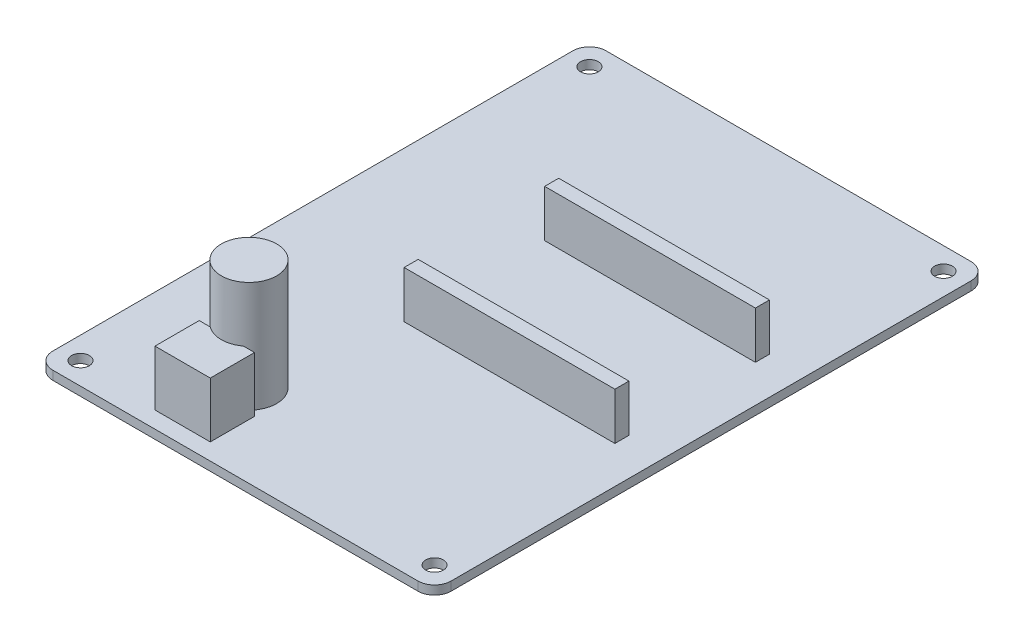
ISO-10303-21;
HEADER;
FILE_DESCRIPTION(('STEP AP214'),'2;1');
FILE_NAME('part.step','',(''),(''),'','','');
FILE_SCHEMA(('AUTOMOTIVE_DESIGN { 1 0 10303 214 1 1 1 1 }'));
ENDSEC;
DATA;
#1=APPLICATION_CONTEXT('core data for automotive mechanical design processes');
#2=APPLICATION_PROTOCOL_DEFINITION('international standard','automotive_design',2000,#1);
#3=PRODUCT_CONTEXT('',#1,'mechanical');
#4=PRODUCT('Part','Part','',(#3));
#5=PRODUCT_RELATED_PRODUCT_CATEGORY('part','',(#4));
#6=PRODUCT_DEFINITION_FORMATION('','',#4);
#7=PRODUCT_DEFINITION_CONTEXT('part definition',#1,'design');
#8=PRODUCT_DEFINITION('design','',#6,#7);
#9=PRODUCT_DEFINITION_SHAPE('','',#8);
#10=(LENGTH_UNIT() NAMED_UNIT(*) SI_UNIT(.MILLI.,.METRE.));
#11=(NAMED_UNIT(*) PLANE_ANGLE_UNIT() SI_UNIT($,.RADIAN.));
#12=(NAMED_UNIT(*) SI_UNIT($,.STERADIAN.) SOLID_ANGLE_UNIT());
#13=UNCERTAINTY_MEASURE_WITH_UNIT(LENGTH_MEASURE(1.E-05),#10,'distance_accuracy_value','');
#14=(GEOMETRIC_REPRESENTATION_CONTEXT(3) GLOBAL_UNCERTAINTY_ASSIGNED_CONTEXT((#13)) GLOBAL_UNIT_ASSIGNED_CONTEXT((#10,
#11,#12)) REPRESENTATION_CONTEXT('',''));
#15=CARTESIAN_POINT('',(0.,0.,0.));
#16=DIRECTION('',(0.,0.,1.));
#17=DIRECTION('',(1.,0.,0.));
#18=AXIS2_PLACEMENT_3D('',#15,#16,#17);
#19=CARTESIAN_POINT('',(237.42,513.12,520.85));
#20=DIRECTION('',(0.,1.,0.));
#21=DIRECTION('',(1.,0.,0.));
#22=AXIS2_PLACEMENT_3D('',#19,#20,#21);
#23=PLANE('',#22);
#24=DIRECTION('',(1.,0.,0.));
#25=VECTOR('',#24,1.);
#26=CARTESIAN_POINT('',(237.42,513.12,520.85));
#27=LINE('',#26,#25);
#28=CARTESIAN_POINT('',(237.42,513.12,520.85));
#29=VERTEX_POINT('',#28);
#30=CARTESIAN_POINT('',(275.52,513.12,520.85));
#31=VERTEX_POINT('',#30);
#32=EDGE_CURVE('E9',#29,#31,#27,.T.);
#33=ORIENTED_EDGE('',*,*,#32,.F.);
#34=DIRECTION('',(0.,0.,1.));
#35=VECTOR('',#34,1.);
#36=CARTESIAN_POINT('',(237.42,513.12,520.85));
#37=LINE('',#36,#35);
#38=CARTESIAN_POINT('',(237.42,513.12,523.39));
#39=VERTEX_POINT('',#38);
#40=EDGE_CURVE('E145',#29,#39,#37,.T.);
#41=ORIENTED_EDGE('',*,*,#40,.T.);
#42=DIRECTION('',(1.,0.,0.));
#43=VECTOR('',#42,1.);
#44=CARTESIAN_POINT('',(237.42,513.12,523.39));
#45=LINE('',#44,#43);
#46=CARTESIAN_POINT('',(275.52,513.12,523.39));
#47=VERTEX_POINT('',#46);
#48=EDGE_CURVE('E291',#39,#47,#45,.T.);
#49=ORIENTED_EDGE('',*,*,#48,.T.);
#50=DIRECTION('',(0.,0.,1.));
#51=VECTOR('',#50,1.);
#52=CARTESIAN_POINT('',(275.52,513.12,520.85));
#53=LINE('',#52,#51);
#54=EDGE_CURVE('E395',#31,#47,#53,.T.);
#55=ORIENTED_EDGE('',*,*,#54,.F.);
#56=EDGE_LOOP('',(#33,#41,#49,#55));
#57=FACE_BOUND('',#56,.T.);
#58=ADVANCED_FACE('F15',(#57),#23,.T.);
#59=CARTESIAN_POINT('',(237.42,513.12,495.45));
#60=DIRECTION('',(0.,1.,0.));
#61=DIRECTION('',(1.,0.,0.));
#62=AXIS2_PLACEMENT_3D('',#59,#60,#61);
#63=PLANE('',#62);
#64=DIRECTION('',(1.,0.,0.));
#65=VECTOR('',#64,1.);
#66=CARTESIAN_POINT('',(237.42,513.12,495.45));
#67=LINE('',#66,#65);
#68=CARTESIAN_POINT('',(237.42,513.12,495.45));
#69=VERTEX_POINT('',#68);
#70=CARTESIAN_POINT('',(275.52,513.12,495.45));
#71=VERTEX_POINT('',#70);
#72=EDGE_CURVE('E136',#69,#71,#67,.T.);
#73=ORIENTED_EDGE('',*,*,#72,.F.);
#74=DIRECTION('',(0.,0.,1.));
#75=VECTOR('',#74,1.);
#76=CARTESIAN_POINT('',(237.42,513.12,495.45));
#77=LINE('',#76,#75);
#78=CARTESIAN_POINT('',(237.42,513.12,497.99));
#79=VERTEX_POINT('',#78);
#80=EDGE_CURVE('E377',#69,#79,#77,.T.);
#81=ORIENTED_EDGE('',*,*,#80,.T.);
#82=DIRECTION('',(1.,0.,0.));
#83=VECTOR('',#82,1.);
#84=CARTESIAN_POINT('',(237.42,513.12,497.99));
#85=LINE('',#84,#83);
#86=CARTESIAN_POINT('',(275.52,513.12,497.99));
#87=VERTEX_POINT('',#86);
#88=EDGE_CURVE('E778',#79,#87,#85,.T.);
#89=ORIENTED_EDGE('',*,*,#88,.T.);
#90=DIRECTION('',(0.,0.,1.));
#91=VECTOR('',#90,1.);
#92=CARTESIAN_POINT('',(275.52,513.12,495.45));
#93=LINE('',#92,#91);
#94=EDGE_CURVE('E374',#71,#87,#93,.T.);
#95=ORIENTED_EDGE('',*,*,#94,.F.);
#96=EDGE_LOOP('',(#73,#81,#89,#95));
#97=FACE_BOUND('',#96,.T.);
#98=ADVANCED_FACE('F17',(#97),#63,.T.);
#99=CARTESIAN_POINT('',(233.71,524.62,547.72));
#100=DIRECTION('',(0.,-1.,0.));
#101=DIRECTION('',(0.,0.,-1.));
#102=AXIS2_PLACEMENT_3D('',#99,#100,#101);
#103=PLANE('',#102);
#104=CARTESIAN_POINT('',(233.71,524.62,547.72));
#105=DIRECTION('',(0.,-1.,0.));
#106=DIRECTION('',(1.,0.,0.));
#107=AXIS2_PLACEMENT_3D('',#104,#105,#106);
#108=CIRCLE('',#107,5.);
#109=CARTESIAN_POINT('',(238.71,524.62,547.72));
#110=VERTEX_POINT('',#109);
#111=EDGE_CURVE('E349',#110,#110,#108,.T.);
#112=ORIENTED_EDGE('',*,*,#111,.F.);
#113=EDGE_LOOP('',(#112));
#114=FACE_BOUND('',#113,.T.);
#115=ADVANCED_FACE('F605',(#114),#103,.F.);
#116=CARTESIAN_POINT('',(228.71,514.62,551.72));
#117=DIRECTION('',(0.,1.,0.));
#118=DIRECTION('',(1.,0.,0.));
#119=AXIS2_PLACEMENT_3D('',#116,#117,#118);
#120=PLANE('',#119);
#121=DIRECTION('',(1.,0.,0.));
#122=VECTOR('',#121,1.);
#123=CARTESIAN_POINT('',(228.71,514.62,551.72));
#124=LINE('',#123,#122);
#125=CARTESIAN_POINT('',(228.71,514.62,551.72));
#126=VERTEX_POINT('',#125);
#127=CARTESIAN_POINT('',(230.70999999998,514.62,551.72));
#128=VERTEX_POINT('',#127);
#129=EDGE_CURVE('E273',#126,#128,#124,.T.);
#130=ORIENTED_EDGE('',*,*,#129,.F.);
#131=DIRECTION('',(0.,0.,1.));
#132=VECTOR('',#131,1.);
#133=CARTESIAN_POINT('',(228.71,514.62,551.72));
#134=LINE('',#133,#132);
#135=CARTESIAN_POINT('',(228.71,514.62,559.72));
#136=VERTEX_POINT('',#135);
#137=EDGE_CURVE('E238',#126,#136,#134,.T.);
#138=ORIENTED_EDGE('',*,*,#137,.T.);
#139=DIRECTION('',(1.,0.,0.));
#140=VECTOR('',#139,1.);
#141=CARTESIAN_POINT('',(228.71,514.62,559.72));
#142=LINE('',#141,#140);
#143=CARTESIAN_POINT('',(238.71,514.62,559.72));
#144=VERTEX_POINT('',#143);
#145=EDGE_CURVE('E237',#136,#144,#142,.T.);
#146=ORIENTED_EDGE('',*,*,#145,.T.);
#147=DIRECTION('',(0.,0.,1.));
#148=VECTOR('',#147,1.);
#149=CARTESIAN_POINT('',(238.71,514.62,551.72));
#150=LINE('',#149,#148);
#151=CARTESIAN_POINT('',(238.71,514.62,551.72));
#152=VERTEX_POINT('',#151);
#153=EDGE_CURVE('E233',#152,#144,#150,.T.);
#154=ORIENTED_EDGE('',*,*,#153,.F.);
#155=DIRECTION('',(1.,0.,0.));
#156=VECTOR('',#155,1.);
#157=CARTESIAN_POINT('',(228.71,514.62,551.72));
#158=LINE('',#157,#156);
#159=CARTESIAN_POINT('',(236.71000000001,514.62,551.72));
#160=VERTEX_POINT('',#159);
#161=EDGE_CURVE('E368',#160,#152,#158,.T.);
#162=ORIENTED_EDGE('',*,*,#161,.F.);
#163=CARTESIAN_POINT('',(233.71,514.62,547.72));
#164=DIRECTION('',(0.,-1.,0.));
#165=DIRECTION('',(1.,0.,0.));
#166=AXIS2_PLACEMENT_3D('',#163,#164,#165);
#167=CIRCLE('',#166,5.);
#168=EDGE_CURVE('E355',#160,#128,#167,.T.);
#169=ORIENTED_EDGE('',*,*,#168,.T.);
#170=EDGE_LOOP('',(#130,#138,#146,#154,#162,#169));
#171=FACE_BOUND('',#170,.T.);
#172=ADVANCED_FACE('F564',(#171),#120,.T.);
#173=CARTESIAN_POINT('',(237.42,504.62,520.85));
#174=DIRECTION('',(0.,0.,1.));
#175=DIRECTION('',(1.,0.,0.));
#176=AXIS2_PLACEMENT_3D('',#173,#174,#175);
#177=PLANE('',#176);
#178=ORIENTED_EDGE('',*,*,#32,.T.);
#179=DIRECTION('',(0.,1.,0.));
#180=VECTOR('',#179,1.);
#181=CARTESIAN_POINT('',(275.52,504.62,520.85));
#182=LINE('',#181,#180);
#183=CARTESIAN_POINT('',(275.52,504.62,520.85));
#184=VERTEX_POINT('',#183);
#185=EDGE_CURVE('E389',#184,#31,#182,.T.);
#186=ORIENTED_EDGE('',*,*,#185,.F.);
#187=DIRECTION('',(1.,0.,0.));
#188=VECTOR('',#187,1.);
#189=CARTESIAN_POINT('',(237.42,504.62,520.85));
#190=LINE('',#189,#188);
#191=CARTESIAN_POINT('',(237.42,504.62,520.85));
#192=VERTEX_POINT('',#191);
#193=EDGE_CURVE('E309',#192,#184,#190,.T.);
#194=ORIENTED_EDGE('',*,*,#193,.F.);
#195=DIRECTION('',(0.,1.,0.));
#196=VECTOR('',#195,1.);
#197=CARTESIAN_POINT('',(237.42,504.62,520.85));
#198=LINE('',#197,#196);
#199=EDGE_CURVE('E25',#192,#29,#198,.T.);
#200=ORIENTED_EDGE('',*,*,#199,.T.);
#201=EDGE_LOOP('',(#178,#186,#194,#200));
#202=FACE_BOUND('',#201,.T.);
#203=ADVANCED_FACE('F559',(#202),#177,.F.);
#204=CARTESIAN_POINT('',(237.42,504.62,520.85));
#205=DIRECTION('',(1.,0.,0.));
#206=DIRECTION('',(0.,1.,0.));
#207=AXIS2_PLACEMENT_3D('',#204,#205,#206);
#208=PLANE('',#207);
#209=DIRECTION('',(0.,1.,0.));
#210=VECTOR('',#209,1.);
#211=CARTESIAN_POINT('',(237.42,504.62,523.39));
#212=LINE('',#211,#210);
#213=CARTESIAN_POINT('',(237.42,504.62,523.39));
#214=VERTEX_POINT('',#213);
#215=EDGE_CURVE('E292',#214,#39,#212,.T.);
#216=ORIENTED_EDGE('',*,*,#215,.T.);
#217=ORIENTED_EDGE('',*,*,#40,.F.);
#218=ORIENTED_EDGE('',*,*,#199,.F.);
#219=DIRECTION('',(0.,0.,1.));
#220=VECTOR('',#219,1.);
#221=CARTESIAN_POINT('',(237.42,504.62,520.85));
#222=LINE('',#221,#220);
#223=EDGE_CURVE('E305',#192,#214,#222,.T.);
#224=ORIENTED_EDGE('',*,*,#223,.T.);
#225=EDGE_LOOP('',(#216,#217,#218,#224));
#226=FACE_BOUND('',#225,.T.);
#227=ADVANCED_FACE('F454',(#226),#208,.F.);
#228=CARTESIAN_POINT('',(275.52,504.62,520.85));
#229=DIRECTION('',(1.,0.,0.));
#230=DIRECTION('',(0.,1.,0.));
#231=AXIS2_PLACEMENT_3D('',#228,#229,#230);
#232=PLANE('',#231);
#233=DIRECTION('',(0.,0.,1.));
#234=VECTOR('',#233,1.);
#235=CARTESIAN_POINT('',(275.52,504.62,520.85));
#236=LINE('',#235,#234);
#237=CARTESIAN_POINT('',(275.52,504.62,523.39));
#238=VERTEX_POINT('',#237);
#239=EDGE_CURVE('E317',#184,#238,#236,.T.);
#240=ORIENTED_EDGE('',*,*,#239,.F.);
#241=ORIENTED_EDGE('',*,*,#185,.T.);
#242=ORIENTED_EDGE('',*,*,#54,.T.);
#243=DIRECTION('',(0.,1.,0.));
#244=VECTOR('',#243,1.);
#245=CARTESIAN_POINT('',(275.52,504.62,523.39));
#246=LINE('',#245,#244);
#247=EDGE_CURVE('E287',#238,#47,#246,.T.);
#248=ORIENTED_EDGE('',*,*,#247,.F.);
#249=EDGE_LOOP('',(#240,#241,#242,#248));
#250=FACE_BOUND('',#249,.T.);
#251=ADVANCED_FACE('F448',(#250),#232,.T.);
#252=CARTESIAN_POINT('',(237.42,504.62,523.39));
#253=DIRECTION('',(0.,0.,1.));
#254=DIRECTION('',(1.,0.,0.));
#255=AXIS2_PLACEMENT_3D('',#252,#253,#254);
#256=PLANE('',#255);
#257=ORIENTED_EDGE('',*,*,#215,.F.);
#258=DIRECTION('',(1.,0.,0.));
#259=VECTOR('',#258,1.);
#260=CARTESIAN_POINT('',(237.42,504.62,523.39));
#261=LINE('',#260,#259);
#262=EDGE_CURVE('E310',#214,#238,#261,.T.);
#263=ORIENTED_EDGE('',*,*,#262,.T.);
#264=ORIENTED_EDGE('',*,*,#247,.T.);
#265=ORIENTED_EDGE('',*,*,#48,.F.);
#266=EDGE_LOOP('',(#257,#263,#264,#265));
#267=FACE_BOUND('',#266,.T.);
#268=ADVANCED_FACE('F453',(#267),#256,.T.);
#269=CARTESIAN_POINT('',(237.42,504.62,495.45));
#270=DIRECTION('',(0.,0.,1.));
#271=DIRECTION('',(1.,0.,0.));
#272=AXIS2_PLACEMENT_3D('',#269,#270,#271);
#273=PLANE('',#272);
#274=ORIENTED_EDGE('',*,*,#72,.T.);
#275=DIRECTION('',(0.,1.,0.));
#276=VECTOR('',#275,1.);
#277=CARTESIAN_POINT('',(275.52,504.62,495.45));
#278=LINE('',#277,#276);
#279=CARTESIAN_POINT('',(275.52,504.62,495.45));
#280=VERTEX_POINT('',#279);
#281=EDGE_CURVE('E378',#280,#71,#278,.T.);
#282=ORIENTED_EDGE('',*,*,#281,.F.);
#283=DIRECTION('',(1.,0.,0.));
#284=VECTOR('',#283,1.);
#285=CARTESIAN_POINT('',(237.42,504.62,495.45));
#286=LINE('',#285,#284);
#287=CARTESIAN_POINT('',(237.42,504.62,495.45));
#288=VERTEX_POINT('',#287);
#289=EDGE_CURVE('E296',#288,#280,#286,.T.);
#290=ORIENTED_EDGE('',*,*,#289,.F.);
#291=DIRECTION('',(0.,1.,0.));
#292=VECTOR('',#291,1.);
#293=CARTESIAN_POINT('',(237.42,504.62,495.45));
#294=LINE('',#293,#292);
#295=EDGE_CURVE('E379',#288,#69,#294,.T.);
#296=ORIENTED_EDGE('',*,*,#295,.T.);
#297=EDGE_LOOP('',(#274,#282,#290,#296));
#298=FACE_BOUND('',#297,.T.);
#299=ADVANCED_FACE('F643',(#298),#273,.F.);
#300=CARTESIAN_POINT('',(237.42,504.62,495.45));
#301=DIRECTION('',(1.,0.,0.));
#302=DIRECTION('',(0.,1.,0.));
#303=AXIS2_PLACEMENT_3D('',#300,#301,#302);
#304=PLANE('',#303);
#305=DIRECTION('',(0.,1.,0.));
#306=VECTOR('',#305,1.);
#307=CARTESIAN_POINT('',(237.42,504.62,497.99));
#308=LINE('',#307,#306);
#309=CARTESIAN_POINT('',(237.42,504.62,497.99));
#310=VERTEX_POINT('',#309);
#311=EDGE_CURVE('E369',#310,#79,#308,.T.);
#312=ORIENTED_EDGE('',*,*,#311,.T.);
#313=ORIENTED_EDGE('',*,*,#80,.F.);
#314=ORIENTED_EDGE('',*,*,#295,.F.);
#315=DIRECTION('',(0.,0.,1.));
#316=VECTOR('',#315,1.);
#317=CARTESIAN_POINT('',(237.42,504.62,495.45));
#318=LINE('',#317,#316);
#319=EDGE_CURVE('E286',#288,#310,#318,.T.);
#320=ORIENTED_EDGE('',*,*,#319,.T.);
#321=EDGE_LOOP('',(#312,#313,#314,#320));
#322=FACE_BOUND('',#321,.T.);
#323=ADVANCED_FACE('F627',(#322),#304,.F.);
#324=CARTESIAN_POINT('',(275.52,504.62,495.45));
#325=DIRECTION('',(1.,0.,0.));
#326=DIRECTION('',(0.,1.,0.));
#327=AXIS2_PLACEMENT_3D('',#324,#325,#326);
#328=PLANE('',#327);
#329=DIRECTION('',(0.,0.,1.));
#330=VECTOR('',#329,1.);
#331=CARTESIAN_POINT('',(275.52,504.62,495.45));
#332=LINE('',#331,#330);
#333=CARTESIAN_POINT('',(275.52,504.62,497.99));
#334=VERTEX_POINT('',#333);
#335=EDGE_CURVE('E300',#280,#334,#332,.T.);
#336=ORIENTED_EDGE('',*,*,#335,.F.);
#337=ORIENTED_EDGE('',*,*,#281,.T.);
#338=ORIENTED_EDGE('',*,*,#94,.T.);
#339=DIRECTION('',(0.,1.,0.));
#340=VECTOR('',#339,1.);
#341=CARTESIAN_POINT('',(275.52,504.62,497.99));
#342=LINE('',#341,#340);
#343=EDGE_CURVE('E373',#334,#87,#342,.T.);
#344=ORIENTED_EDGE('',*,*,#343,.F.);
#345=EDGE_LOOP('',(#336,#337,#338,#344));
#346=FACE_BOUND('',#345,.T.);
#347=ADVANCED_FACE('F618',(#346),#328,.T.);
#348=CARTESIAN_POINT('',(237.42,504.62,497.99));
#349=DIRECTION('',(0.,0.,1.));
#350=DIRECTION('',(1.,0.,0.));
#351=AXIS2_PLACEMENT_3D('',#348,#349,#350);
#352=PLANE('',#351);
#353=ORIENTED_EDGE('',*,*,#311,.F.);
#354=DIRECTION('',(1.,0.,0.));
#355=VECTOR('',#354,1.);
#356=CARTESIAN_POINT('',(237.42,504.62,497.99));
#357=LINE('',#356,#355);
#358=EDGE_CURVE('E282',#310,#334,#357,.T.);
#359=ORIENTED_EDGE('',*,*,#358,.T.);
#360=ORIENTED_EDGE('',*,*,#343,.T.);
#361=ORIENTED_EDGE('',*,*,#88,.F.);
#362=EDGE_LOOP('',(#353,#359,#360,#361));
#363=FACE_BOUND('',#362,.T.);
#364=ADVANCED_FACE('F600',(#363),#352,.T.);
#365=CARTESIAN_POINT('',(228.71,504.62,551.72));
#366=DIRECTION('',(0.,0.,1.));
#367=DIRECTION('',(1.,0.,0.));
#368=AXIS2_PLACEMENT_3D('',#365,#366,#367);
#369=PLANE('',#368);
#370=DIRECTION('',(0.,1.,0.));
#371=VECTOR('',#370,1.);
#372=CARTESIAN_POINT('',(238.71,504.62,551.72));
#373=LINE('',#372,#371);
#374=CARTESIAN_POINT('',(238.71,504.62,551.72));
#375=VERTEX_POINT('',#374);
#376=EDGE_CURVE('E220',#375,#152,#373,.T.);
#377=ORIENTED_EDGE('',*,*,#376,.F.);
#378=DIRECTION('',(1.,0.,0.));
#379=VECTOR('',#378,1.);
#380=CARTESIAN_POINT('',(228.71,504.62,551.72));
#381=LINE('',#380,#379);
#382=CARTESIAN_POINT('',(236.71,504.62,551.72));
#383=VERTEX_POINT('',#382);
#384=EDGE_CURVE('E255',#383,#375,#381,.T.);
#385=ORIENTED_EDGE('',*,*,#384,.F.);
#386=DIRECTION('',(0.,-1.,0.));
#387=VECTOR('',#386,1.);
#388=CARTESIAN_POINT('',(236.71,504.62,551.72));
#389=LINE('',#388,#387);
#390=EDGE_CURVE('E356',#160,#383,#389,.T.);
#391=ORIENTED_EDGE('',*,*,#390,.F.);
#392=ORIENTED_EDGE('',*,*,#161,.T.);
#393=EDGE_LOOP('',(#377,#385,#391,#392));
#394=FACE_BOUND('',#393,.T.);
#395=ADVANCED_FACE('F503',(#394),#369,.F.);
#396=CARTESIAN_POINT('',(238.71,504.62,551.72));
#397=DIRECTION('',(1.,0.,0.));
#398=DIRECTION('',(0.,1.,0.));
#399=AXIS2_PLACEMENT_3D('',#396,#397,#398);
#400=PLANE('',#399);
#401=DIRECTION('',(0.,0.,1.));
#402=VECTOR('',#401,1.);
#403=CARTESIAN_POINT('',(238.71,504.62,551.72));
#404=LINE('',#403,#402);
#405=CARTESIAN_POINT('',(238.71,504.62,559.72));
#406=VERTEX_POINT('',#405);
#407=EDGE_CURVE('E230',#375,#406,#404,.T.);
#408=ORIENTED_EDGE('',*,*,#407,.F.);
#409=ORIENTED_EDGE('',*,*,#376,.T.);
#410=ORIENTED_EDGE('',*,*,#153,.T.);
#411=DIRECTION('',(0.,1.,0.));
#412=VECTOR('',#411,1.);
#413=CARTESIAN_POINT('',(238.71,504.62,559.72));
#414=LINE('',#413,#412);
#415=EDGE_CURVE('E226',#406,#144,#414,.T.);
#416=ORIENTED_EDGE('',*,*,#415,.F.);
#417=EDGE_LOOP('',(#408,#409,#410,#416));
#418=FACE_BOUND('',#417,.T.);
#419=ADVANCED_FACE('F228',(#418),#400,.T.);
#420=CARTESIAN_POINT('',(228.71,504.62,559.72));
#421=DIRECTION('',(0.,0.,1.));
#422=DIRECTION('',(1.,0.,0.));
#423=AXIS2_PLACEMENT_3D('',#420,#421,#422);
#424=PLANE('',#423);
#425=DIRECTION('',(0.,1.,0.));
#426=VECTOR('',#425,1.);
#427=CARTESIAN_POINT('',(228.71,504.62,559.72));
#428=LINE('',#427,#426);
#429=CARTESIAN_POINT('',(228.71,504.62,559.72));
#430=VERTEX_POINT('',#429);
#431=EDGE_CURVE('E244',#430,#136,#428,.T.);
#432=ORIENTED_EDGE('',*,*,#431,.F.);
#433=DIRECTION('',(1.,0.,0.));
#434=VECTOR('',#433,1.);
#435=CARTESIAN_POINT('',(228.71,504.62,559.72));
#436=LINE('',#435,#434);
#437=EDGE_CURVE('E241',#430,#406,#436,.T.);
#438=ORIENTED_EDGE('',*,*,#437,.T.);
#439=ORIENTED_EDGE('',*,*,#415,.T.);
#440=ORIENTED_EDGE('',*,*,#145,.F.);
#441=EDGE_LOOP('',(#432,#438,#439,#440));
#442=FACE_BOUND('',#441,.T.);
#443=ADVANCED_FACE('F242',(#442),#424,.T.);
#444=CARTESIAN_POINT('',(228.71,504.62,551.72));
#445=DIRECTION('',(1.,0.,0.));
#446=DIRECTION('',(0.,1.,0.));
#447=AXIS2_PLACEMENT_3D('',#444,#445,#446);
#448=PLANE('',#447);
#449=ORIENTED_EDGE('',*,*,#431,.T.);
#450=ORIENTED_EDGE('',*,*,#137,.F.);
#451=DIRECTION('',(0.,1.,0.));
#452=VECTOR('',#451,1.);
#453=CARTESIAN_POINT('',(228.71,504.62,551.72));
#454=LINE('',#453,#452);
#455=CARTESIAN_POINT('',(228.71,504.62,551.72));
#456=VERTEX_POINT('',#455);
#457=EDGE_CURVE('E359',#456,#126,#454,.T.);
#458=ORIENTED_EDGE('',*,*,#457,.F.);
#459=DIRECTION('',(0.,0.,1.));
#460=VECTOR('',#459,1.);
#461=CARTESIAN_POINT('',(228.71,504.62,551.72));
#462=LINE('',#461,#460);
#463=EDGE_CURVE('E249',#456,#430,#462,.T.);
#464=ORIENTED_EDGE('',*,*,#463,.T.);
#465=EDGE_LOOP('',(#449,#450,#458,#464));
#466=FACE_BOUND('',#465,.T.);
#467=ADVANCED_FACE('F404',(#466),#448,.F.);
#468=CARTESIAN_POINT('',(228.71,504.62,551.72));
#469=DIRECTION('',(0.,0.,1.));
#470=DIRECTION('',(1.,0.,0.));
#471=AXIS2_PLACEMENT_3D('',#468,#469,#470);
#472=PLANE('',#471);
#473=DIRECTION('',(0.,-1.,0.));
#474=VECTOR('',#473,1.);
#475=CARTESIAN_POINT('',(230.71,504.62,551.72));
#476=LINE('',#475,#474);
#477=CARTESIAN_POINT('',(230.71,504.62,551.72));
#478=VERTEX_POINT('',#477);
#479=EDGE_CURVE('E352',#128,#478,#476,.T.);
#480=ORIENTED_EDGE('',*,*,#479,.T.);
#481=DIRECTION('',(1.,0.,0.));
#482=VECTOR('',#481,1.);
#483=CARTESIAN_POINT('',(228.71,504.62,551.72));
#484=LINE('',#483,#482);
#485=EDGE_CURVE('E278',#456,#478,#484,.T.);
#486=ORIENTED_EDGE('',*,*,#485,.F.);
#487=ORIENTED_EDGE('',*,*,#457,.T.);
#488=ORIENTED_EDGE('',*,*,#129,.T.);
#489=EDGE_LOOP('',(#480,#486,#487,#488));
#490=FACE_BOUND('',#489,.T.);
#491=ADVANCED_FACE('F409',(#490),#472,.F.);
#492=CARTESIAN_POINT('',(233.71,504.62,547.72));
#493=DIRECTION('',(0.,-1.,0.));
#494=DIRECTION('',(1.,0.,0.));
#495=AXIS2_PLACEMENT_3D('',#492,#493,#494);
#496=CYLINDRICAL_SURFACE('',#495,5.);
#497=CARTESIAN_POINT('',(233.71,504.62,547.72));
#498=DIRECTION('',(0.,-1.,0.));
#499=DIRECTION('',(1.,0.,0.));
#500=AXIS2_PLACEMENT_3D('',#497,#498,#499);
#501=CIRCLE('',#500,5.);
#502=CARTESIAN_POINT('',(238.71,504.62,547.72));
#503=VERTEX_POINT('',#502);
#504=EDGE_CURVE('E262',#503,#383,#501,.T.);
#505=ORIENTED_EDGE('',*,*,#504,.F.);
#506=DIRECTION('',(0.,1.,0.));
#507=VECTOR('',#506,1.);
#508=CARTESIAN_POINT('',(238.71,504.62,547.72));
#509=LINE('',#508,#507);
#510=EDGE_CURVE('E345',#503,#110,#509,.T.);
#511=ORIENTED_EDGE('',*,*,#510,.T.);
#512=ORIENTED_EDGE('',*,*,#111,.T.);
#513=ORIENTED_EDGE('',*,*,#510,.F.);
#514=CARTESIAN_POINT('',(233.71,504.62,547.72));
#515=DIRECTION('',(0.,-1.,0.));
#516=DIRECTION('',(1.,0.,0.));
#517=AXIS2_PLACEMENT_3D('',#514,#515,#516);
#518=CIRCLE('',#517,5.);
#519=EDGE_CURVE('E268',#478,#503,#518,.T.);
#520=ORIENTED_EDGE('',*,*,#519,.F.);
#521=ORIENTED_EDGE('',*,*,#479,.F.);
#522=ORIENTED_EDGE('',*,*,#168,.F.);
#523=ORIENTED_EDGE('',*,*,#390,.T.);
#524=EDGE_LOOP('',(#505,#511,#512,#513,#520,#521,#522,#523));
#525=FACE_BOUND('',#524,.T.);
#526=ADVANCED_FACE('F417',(#525),#496,.T.);
#527=CARTESIAN_POINT('',(278.25,502.02,558.72));
#528=DIRECTION('',(0.,-1.,0.));
#529=DIRECTION('',(1.,0.,0.));
#530=AXIS2_PLACEMENT_3D('',#527,#528,#529);
#531=CYLINDRICAL_SURFACE('',#530,1.6);
#532=DIRECTION('',(0.,1.,0.));
#533=VECTOR('',#532,1.);
#534=CARTESIAN_POINT('',(279.85,502.02,558.72));
#535=LINE('',#534,#533);
#536=CARTESIAN_POINT('',(279.85,503.02,558.72));
#537=VERTEX_POINT('',#536);
#538=CARTESIAN_POINT('',(279.85,504.62,558.72));
#539=VERTEX_POINT('',#538);
#540=EDGE_CURVE('E342',#537,#539,#535,.T.);
#541=ORIENTED_EDGE('',*,*,#540,.T.);
#542=CARTESIAN_POINT('',(278.25,504.62,558.72));
#543=DIRECTION('',(0.,-1.,0.));
#544=DIRECTION('',(1.,0.,0.));
#545=AXIS2_PLACEMENT_3D('',#542,#543,#544);
#546=CIRCLE('',#545,1.6);
#547=EDGE_CURVE('E318',#539,#539,#546,.T.);
#548=ORIENTED_EDGE('',*,*,#547,.F.);
#549=ORIENTED_EDGE('',*,*,#540,.F.);
#550=CARTESIAN_POINT('',(278.25,503.02,558.72));
#551=DIRECTION('',(0.,-1.,0.));
#552=DIRECTION('',(1.,0.,0.));
#553=AXIS2_PLACEMENT_3D('',#550,#551,#552);
#554=CIRCLE('',#553,1.6);
#555=EDGE_CURVE('E763',#537,#537,#554,.T.);
#556=ORIENTED_EDGE('',*,*,#555,.T.);
#557=EDGE_LOOP('',(#541,#548,#549,#556));
#558=FACE_BOUND('',#557,.T.);
#559=ADVANCED_FACE('F422',(#558),#531,.F.);
#560=CARTESIAN_POINT('',(278.25,502.02,466.72));
#561=DIRECTION('',(0.,-1.,0.));
#562=DIRECTION('',(1.,0.,0.));
#563=AXIS2_PLACEMENT_3D('',#560,#561,#562);
#564=CYLINDRICAL_SURFACE('',#563,1.6);
#565=DIRECTION('',(0.,1.,0.));
#566=VECTOR('',#565,1.);
#567=CARTESIAN_POINT('',(279.85,502.02,466.72));
#568=LINE('',#567,#566);
#569=CARTESIAN_POINT('',(279.85,503.02,466.72));
#570=VERTEX_POINT('',#569);
#571=CARTESIAN_POINT('',(279.85,504.62,466.72));
#572=VERTEX_POINT('',#571);
#573=EDGE_CURVE('E339',#570,#572,#568,.T.);
#574=ORIENTED_EDGE('',*,*,#573,.T.);
#575=CARTESIAN_POINT('',(278.25,504.62,466.72));
#576=DIRECTION('',(0.,-1.,0.));
#577=DIRECTION('',(1.,0.,0.));
#578=AXIS2_PLACEMENT_3D('',#575,#576,#577);
#579=CIRCLE('',#578,1.6);
#580=EDGE_CURVE('E304',#572,#572,#579,.T.);
#581=ORIENTED_EDGE('',*,*,#580,.F.);
#582=ORIENTED_EDGE('',*,*,#573,.F.);
#583=CARTESIAN_POINT('',(278.25,503.02,466.72));
#584=DIRECTION('',(0.,-1.,0.));
#585=DIRECTION('',(1.,0.,0.));
#586=AXIS2_PLACEMENT_3D('',#583,#584,#585);
#587=CIRCLE('',#586,1.6);
#588=EDGE_CURVE('E761',#570,#570,#587,.T.);
#589=ORIENTED_EDGE('',*,*,#588,.T.);
#590=EDGE_LOOP('',(#574,#581,#582,#589));
#591=FACE_BOUND('',#590,.T.);
#592=ADVANCED_FACE('F431',(#591),#564,.F.);
#593=CARTESIAN_POINT('',(214.25,502.02,558.72));
#594=DIRECTION('',(0.,-1.,0.));
#595=DIRECTION('',(1.,0.,0.));
#596=AXIS2_PLACEMENT_3D('',#593,#594,#595);
#597=CYLINDRICAL_SURFACE('',#596,1.6);
#598=DIRECTION('',(0.,1.,0.));
#599=VECTOR('',#598,1.);
#600=CARTESIAN_POINT('',(215.85,502.02,558.72));
#601=LINE('',#600,#599);
#602=CARTESIAN_POINT('',(215.85,503.02,558.72));
#603=VERTEX_POINT('',#602);
#604=CARTESIAN_POINT('',(215.85,504.62,558.72));
#605=VERTEX_POINT('',#604);
#606=EDGE_CURVE('E336',#603,#605,#601,.T.);
#607=ORIENTED_EDGE('',*,*,#606,.T.);
#608=CARTESIAN_POINT('',(214.25,504.62,558.72));
#609=DIRECTION('',(0.,-1.,0.));
#610=DIRECTION('',(1.,0.,0.));
#611=AXIS2_PLACEMENT_3D('',#608,#609,#610);
#612=CIRCLE('',#611,1.6);
#613=EDGE_CURVE('E270',#605,#605,#612,.T.);
#614=ORIENTED_EDGE('',*,*,#613,.F.);
#615=ORIENTED_EDGE('',*,*,#606,.F.);
#616=CARTESIAN_POINT('',(214.25,503.02,558.72));
#617=DIRECTION('',(0.,-1.,0.));
#618=DIRECTION('',(1.,0.,0.));
#619=AXIS2_PLACEMENT_3D('',#616,#617,#618);
#620=CIRCLE('',#619,1.6);
#621=EDGE_CURVE('E794',#603,#603,#620,.T.);
#622=ORIENTED_EDGE('',*,*,#621,.T.);
#623=EDGE_LOOP('',(#607,#614,#615,#622));
#624=FACE_BOUND('',#623,.T.);
#625=ADVANCED_FACE('F546',(#624),#597,.F.);
#626=CARTESIAN_POINT('',(214.25,502.02,466.72));
#627=DIRECTION('',(0.,-1.,0.));
#628=DIRECTION('',(1.,0.,0.));
#629=AXIS2_PLACEMENT_3D('',#626,#627,#628);
#630=CYLINDRICAL_SURFACE('',#629,1.6);
#631=DIRECTION('',(0.,1.,0.));
#632=VECTOR('',#631,1.);
#633=CARTESIAN_POINT('',(215.85,502.02,466.72));
#634=LINE('',#633,#632);
#635=CARTESIAN_POINT('',(215.85,503.02,466.72));
#636=VERTEX_POINT('',#635);
#637=CARTESIAN_POINT('',(215.85,504.62,466.72));
#638=VERTEX_POINT('',#637);
#639=EDGE_CURVE('E333',#636,#638,#634,.T.);
#640=ORIENTED_EDGE('',*,*,#639,.T.);
#641=CARTESIAN_POINT('',(214.25,504.62,466.72));
#642=DIRECTION('',(0.,-1.,0.));
#643=DIRECTION('',(1.,0.,0.));
#644=AXIS2_PLACEMENT_3D('',#641,#642,#643);
#645=CIRCLE('',#644,1.6);
#646=EDGE_CURVE('E266',#638,#638,#645,.T.);
#647=ORIENTED_EDGE('',*,*,#646,.F.);
#648=ORIENTED_EDGE('',*,*,#639,.F.);
#649=CARTESIAN_POINT('',(214.25,503.02,466.72));
#650=DIRECTION('',(0.,-1.,0.));
#651=DIRECTION('',(1.,0.,0.));
#652=AXIS2_PLACEMENT_3D('',#649,#650,#651);
#653=CIRCLE('',#652,1.6);
#654=EDGE_CURVE('E742',#636,#636,#653,.T.);
#655=ORIENTED_EDGE('',*,*,#654,.T.);
#656=EDGE_LOOP('',(#640,#647,#648,#655));
#657=FACE_BOUND('',#656,.T.);
#658=ADVANCED_FACE('F492',(#657),#630,.F.);
#659=CARTESIAN_POINT('',(210.25,503.02,562.72));
#660=DIRECTION('',(0.,0.,1.));
#661=DIRECTION('',(1.,0.,0.));
#662=AXIS2_PLACEMENT_3D('',#659,#660,#661);
#663=PLANE('',#662);
#664=DIRECTION('',(1.,0.,0.));
#665=VECTOR('',#664,1.);
#666=CARTESIAN_POINT('',(210.25,504.62,562.72));
#667=LINE('',#666,#665);
#668=CARTESIAN_POINT('',(213.25,504.62,562.72));
#669=VERTEX_POINT('',#668);
#670=CARTESIAN_POINT('',(279.25,504.62,562.72));
#671=VERTEX_POINT('',#670);
#672=EDGE_CURVE('E820',#669,#671,#667,.T.);
#673=ORIENTED_EDGE('',*,*,#672,.F.);
#674=DIRECTION('',(0.,1.,0.));
#675=VECTOR('',#674,1.);
#676=CARTESIAN_POINT('',(213.25,503.02,562.72));
#677=LINE('',#676,#675);
#678=CARTESIAN_POINT('',(213.25,503.02,562.72));
#679=VERTEX_POINT('',#678);
#680=EDGE_CURVE('E803',#679,#669,#677,.T.);
#681=ORIENTED_EDGE('',*,*,#680,.F.);
#682=DIRECTION('',(1.,0.,0.));
#683=VECTOR('',#682,1.);
#684=CARTESIAN_POINT('',(210.25,503.02,562.72));
#685=LINE('',#684,#683);
#686=CARTESIAN_POINT('',(279.25,503.02,562.72));
#687=VERTEX_POINT('',#686);
#688=EDGE_CURVE('E770',#679,#687,#685,.T.);
#689=ORIENTED_EDGE('',*,*,#688,.T.);
#690=DIRECTION('',(0.,1.,0.));
#691=VECTOR('',#690,1.);
#692=CARTESIAN_POINT('',(279.25,503.02,562.72));
#693=LINE('',#692,#691);
#694=EDGE_CURVE('E330',#687,#671,#693,.T.);
#695=ORIENTED_EDGE('',*,*,#694,.T.);
#696=EDGE_LOOP('',(#673,#681,#689,#695));
#697=FACE_BOUND('',#696,.T.);
#698=ADVANCED_FACE('F486',(#697),#663,.T.);
#699=CARTESIAN_POINT('',(279.25,503.02,559.72));
#700=DIRECTION('',(0.,1.,0.));
#701=DIRECTION('',(1.,0.,0.));
#702=AXIS2_PLACEMENT_3D('',#699,#700,#701);
#703=CYLINDRICAL_SURFACE('',#702,3.);
#704=DIRECTION('',(0.,1.,0.));
#705=VECTOR('',#704,1.);
#706=CARTESIAN_POINT('',(282.25,503.02,559.72));
#707=LINE('',#706,#705);
#708=CARTESIAN_POINT('',(282.25,503.02,559.72));
#709=VERTEX_POINT('',#708);
#710=CARTESIAN_POINT('',(282.25,504.62,559.72));
#711=VERTEX_POINT('',#710);
#712=EDGE_CURVE('E327',#709,#711,#707,.T.);
#713=ORIENTED_EDGE('',*,*,#712,.T.);
#714=CARTESIAN_POINT('',(279.25,504.62,559.72));
#715=DIRECTION('',(0.,-1.,0.));
#716=DIRECTION('',(0.,0.,1.));
#717=AXIS2_PLACEMENT_3D('',#714,#715,#716);
#718=CIRCLE('',#717,3.);
#719=EDGE_CURVE('E824',#711,#671,#718,.T.);
#720=ORIENTED_EDGE('',*,*,#719,.T.);
#721=ORIENTED_EDGE('',*,*,#694,.F.);
#722=CARTESIAN_POINT('',(279.25,503.02,559.72));
#723=DIRECTION('',(0.,-1.,0.));
#724=DIRECTION('',(0.,0.,1.));
#725=AXIS2_PLACEMENT_3D('',#722,#723,#724);
#726=CIRCLE('',#725,3.);
#727=EDGE_CURVE('E753',#709,#687,#726,.T.);
#728=ORIENTED_EDGE('',*,*,#727,.F.);
#729=EDGE_LOOP('',(#713,#720,#721,#728));
#730=FACE_BOUND('',#729,.T.);
#731=ADVANCED_FACE('F491',(#730),#703,.T.);
#732=CARTESIAN_POINT('',(282.25,503.02,462.72));
#733=DIRECTION('',(1.,0.,0.));
#734=DIRECTION('',(0.,1.,0.));
#735=AXIS2_PLACEMENT_3D('',#732,#733,#734);
#736=PLANE('',#735);
#737=DIRECTION('',(0.,0.,1.));
#738=VECTOR('',#737,1.);
#739=CARTESIAN_POINT('',(282.25,503.02,462.72));
#740=LINE('',#739,#738);
#741=CARTESIAN_POINT('',(282.25,503.02,465.72));
#742=VERTEX_POINT('',#741);
#743=EDGE_CURVE('E746',#742,#709,#740,.T.);
#744=ORIENTED_EDGE('',*,*,#743,.F.);
#745=DIRECTION('',(0.,1.,0.));
#746=VECTOR('',#745,1.);
#747=CARTESIAN_POINT('',(282.25,503.02,465.72));
#748=LINE('',#747,#746);
#749=CARTESIAN_POINT('',(282.25,504.62,465.72));
#750=VERTEX_POINT('',#749);
#751=EDGE_CURVE('E326',#742,#750,#748,.T.);
#752=ORIENTED_EDGE('',*,*,#751,.T.);
#753=DIRECTION('',(0.,0.,1.));
#754=VECTOR('',#753,1.);
#755=CARTESIAN_POINT('',(282.25,504.62,462.72));
#756=LINE('',#755,#754);
#757=EDGE_CURVE('E807',#750,#711,#756,.T.);
#758=ORIENTED_EDGE('',*,*,#757,.T.);
#759=ORIENTED_EDGE('',*,*,#712,.F.);
#760=EDGE_LOOP('',(#744,#752,#758,#759));
#761=FACE_BOUND('',#760,.T.);
#762=ADVANCED_FACE('F537',(#761),#736,.T.);
#763=CARTESIAN_POINT('',(279.25,503.02,465.72));
#764=DIRECTION('',(0.,1.,0.));
#765=DIRECTION('',(1.,0.,0.));
#766=AXIS2_PLACEMENT_3D('',#763,#764,#765);
#767=CYLINDRICAL_SURFACE('',#766,3.);
#768=CARTESIAN_POINT('',(279.25,503.02,465.72));
#769=DIRECTION('',(0.,1.,0.));
#770=DIRECTION('',(0.,0.,1.));
#771=AXIS2_PLACEMENT_3D('',#768,#769,#770);
#772=CIRCLE('',#771,3.);
#773=CARTESIAN_POINT('',(279.25,503.02,462.72));
#774=VERTEX_POINT('',#773);
#775=EDGE_CURVE('E738',#742,#774,#772,.T.);
#776=ORIENTED_EDGE('',*,*,#775,.T.);
#777=DIRECTION('',(0.,1.,0.));
#778=VECTOR('',#777,1.);
#779=CARTESIAN_POINT('',(279.25,503.02,462.72));
#780=LINE('',#779,#778);
#781=CARTESIAN_POINT('',(279.25,504.62,462.72));
#782=VERTEX_POINT('',#781);
#783=EDGE_CURVE('E322',#774,#782,#780,.T.);
#784=ORIENTED_EDGE('',*,*,#783,.T.);
#785=CARTESIAN_POINT('',(279.25,504.62,465.72));
#786=DIRECTION('',(0.,1.,0.));
#787=DIRECTION('',(0.,0.,1.));
#788=AXIS2_PLACEMENT_3D('',#785,#786,#787);
#789=CIRCLE('',#788,3.);
#790=EDGE_CURVE('E804',#750,#782,#789,.T.);
#791=ORIENTED_EDGE('',*,*,#790,.F.);
#792=ORIENTED_EDGE('',*,*,#751,.F.);
#793=EDGE_LOOP('',(#776,#784,#791,#792));
#794=FACE_BOUND('',#793,.T.);
#795=ADVANCED_FACE('F528',(#794),#767,.T.);
#796=CARTESIAN_POINT('',(210.25,503.02,462.72));
#797=DIRECTION('',(0.,0.,1.));
#798=DIRECTION('',(1.,0.,0.));
#799=AXIS2_PLACEMENT_3D('',#796,#797,#798);
#800=PLANE('',#799);
#801=ORIENTED_EDGE('',*,*,#783,.F.);
#802=DIRECTION('',(1.,0.,0.));
#803=VECTOR('',#802,1.);
#804=CARTESIAN_POINT('',(210.25,503.02,462.72));
#805=LINE('',#804,#803);
#806=CARTESIAN_POINT('',(213.25,503.02,462.72));
#807=VERTEX_POINT('',#806);
#808=EDGE_CURVE('E729',#807,#774,#805,.T.);
#809=ORIENTED_EDGE('',*,*,#808,.F.);
#810=DIRECTION('',(0.,1.,0.));
#811=VECTOR('',#810,1.);
#812=CARTESIAN_POINT('',(213.25,503.02,462.72));
#813=LINE('',#812,#811);
#814=CARTESIAN_POINT('',(213.25,504.62,462.72));
#815=VERTEX_POINT('',#814);
#816=EDGE_CURVE('E784',#807,#815,#813,.T.);
#817=ORIENTED_EDGE('',*,*,#816,.T.);
#818=DIRECTION('',(1.,0.,0.));
#819=VECTOR('',#818,1.);
#820=CARTESIAN_POINT('',(210.25,504.62,462.72));
#821=LINE('',#820,#819);
#822=EDGE_CURVE('E731',#815,#782,#821,.T.);
#823=ORIENTED_EDGE('',*,*,#822,.T.);
#824=EDGE_LOOP('',(#801,#809,#817,#823));
#825=FACE_BOUND('',#824,.T.);
#826=ADVANCED_FACE('F519',(#825),#800,.F.);
#827=CARTESIAN_POINT('',(210.25,504.62,462.72));
#828=DIRECTION('',(0.,1.,0.));
#829=DIRECTION('',(1.,0.,0.));
#830=AXIS2_PLACEMENT_3D('',#827,#828,#829);
#831=PLANE('',#830);
#832=ORIENTED_EDGE('',*,*,#547,.T.);
#833=EDGE_LOOP('',(#832));
#834=FACE_BOUND('',#833,.T.);
#835=ORIENTED_EDGE('',*,*,#262,.F.);
#836=ORIENTED_EDGE('',*,*,#223,.F.);
#837=ORIENTED_EDGE('',*,*,#193,.T.);
#838=ORIENTED_EDGE('',*,*,#239,.T.);
#839=EDGE_LOOP('',(#835,#836,#837,#838));
#840=FACE_BOUND('',#839,.T.);
#841=ORIENTED_EDGE('',*,*,#580,.T.);
#842=EDGE_LOOP('',(#841));
#843=FACE_BOUND('',#842,.T.);
#844=ORIENTED_EDGE('',*,*,#358,.F.);
#845=ORIENTED_EDGE('',*,*,#319,.F.);
#846=ORIENTED_EDGE('',*,*,#289,.T.);
#847=ORIENTED_EDGE('',*,*,#335,.T.);
#848=EDGE_LOOP('',(#844,#845,#846,#847));
#849=FACE_BOUND('',#848,.T.);
#850=ORIENTED_EDGE('',*,*,#519,.T.);
#851=ORIENTED_EDGE('',*,*,#504,.T.);
#852=ORIENTED_EDGE('',*,*,#384,.T.);
#853=ORIENTED_EDGE('',*,*,#407,.T.);
#854=ORIENTED_EDGE('',*,*,#437,.F.);
#855=ORIENTED_EDGE('',*,*,#463,.F.);
#856=ORIENTED_EDGE('',*,*,#485,.T.);
#857=EDGE_LOOP('',(#850,#851,#852,#853,#854,#855,#856));
#858=FACE_BOUND('',#857,.T.);
#859=ORIENTED_EDGE('',*,*,#613,.T.);
#860=EDGE_LOOP('',(#859));
#861=FACE_BOUND('',#860,.T.);
#862=ORIENTED_EDGE('',*,*,#646,.T.);
#863=EDGE_LOOP('',(#862));
#864=FACE_BOUND('',#863,.T.);
#865=ORIENTED_EDGE('',*,*,#822,.F.);
#866=CARTESIAN_POINT('',(213.25,504.62,465.72));
#867=DIRECTION('',(0.,-1.,0.));
#868=DIRECTION('',(0.,0.,1.));
#869=AXIS2_PLACEMENT_3D('',#866,#867,#868);
#870=CIRCLE('',#869,3.);
#871=CARTESIAN_POINT('',(210.25,504.62,465.72));
#872=VERTEX_POINT('',#871);
#873=EDGE_CURVE('E765',#872,#815,#870,.T.);
#874=ORIENTED_EDGE('',*,*,#873,.F.);
#875=DIRECTION('',(0.,0.,1.));
#876=VECTOR('',#875,1.);
#877=CARTESIAN_POINT('',(210.25,504.62,462.72));
#878=LINE('',#877,#876);
#879=CARTESIAN_POINT('',(210.25,504.62,559.72));
#880=VERTEX_POINT('',#879);
#881=EDGE_CURVE('E856',#872,#880,#878,.T.);
#882=ORIENTED_EDGE('',*,*,#881,.T.);
#883=CARTESIAN_POINT('',(213.25,504.62,559.72));
#884=DIRECTION('',(0.,1.,0.));
#885=DIRECTION('',(0.,0.,1.));
#886=AXIS2_PLACEMENT_3D('',#883,#884,#885);
#887=CIRCLE('',#886,3.);
#888=EDGE_CURVE('E811',#880,#669,#887,.T.);
#889=ORIENTED_EDGE('',*,*,#888,.T.);
#890=ORIENTED_EDGE('',*,*,#672,.T.);
#891=ORIENTED_EDGE('',*,*,#719,.F.);
#892=ORIENTED_EDGE('',*,*,#757,.F.);
#893=ORIENTED_EDGE('',*,*,#790,.T.);
#894=EDGE_LOOP('',(#865,#874,#882,#889,#890,#891,#892,#893));
#895=FACE_BOUND('',#894,.T.);
#896=ADVANCED_FACE('F252',(#834,#840,#843,#849,#858,#861,#864,#895),#831,.T.);
#897=CARTESIAN_POINT('',(213.25,503.02,559.72));
#898=DIRECTION('',(0.,1.,0.));
#899=DIRECTION('',(-1.,0.,0.));
#900=AXIS2_PLACEMENT_3D('',#897,#898,#899);
#901=CYLINDRICAL_SURFACE('',#900,3.);
#902=CARTESIAN_POINT('',(213.25,503.02,559.72));
#903=DIRECTION('',(0.,1.,0.));
#904=DIRECTION('',(0.,0.,1.));
#905=AXIS2_PLACEMENT_3D('',#902,#903,#904);
#906=CIRCLE('',#905,3.);
#907=CARTESIAN_POINT('',(210.25,503.02,559.72));
#908=VERTEX_POINT('',#907);
#909=EDGE_CURVE('E771',#908,#679,#906,.T.);
#910=ORIENTED_EDGE('',*,*,#909,.T.);
#911=ORIENTED_EDGE('',*,*,#680,.T.);
#912=ORIENTED_EDGE('',*,*,#888,.F.);
#913=DIRECTION('',(0.,1.,0.));
#914=VECTOR('',#913,1.);
#915=CARTESIAN_POINT('',(210.25,503.02,559.72));
#916=LINE('',#915,#914);
#917=EDGE_CURVE('E860',#908,#880,#916,.T.);
#918=ORIENTED_EDGE('',*,*,#917,.F.);
#919=EDGE_LOOP('',(#910,#911,#912,#918));
#920=FACE_BOUND('',#919,.T.);
#921=ADVANCED_FACE('F473',(#920),#901,.T.);
#922=CARTESIAN_POINT('',(213.25,503.02,465.72));
#923=DIRECTION('',(0.,1.,0.));
#924=DIRECTION('',(-1.,0.,0.));
#925=AXIS2_PLACEMENT_3D('',#922,#923,#924);
#926=CYLINDRICAL_SURFACE('',#925,3.);
#927=DIRECTION('',(0.,1.,0.));
#928=VECTOR('',#927,1.);
#929=CARTESIAN_POINT('',(210.25,503.02,465.72));
#930=LINE('',#929,#928);
#931=CARTESIAN_POINT('',(210.25,503.02,465.72));
#932=VERTEX_POINT('',#931);
#933=EDGE_CURVE('E757',#932,#872,#930,.T.);
#934=ORIENTED_EDGE('',*,*,#933,.T.);
#935=ORIENTED_EDGE('',*,*,#873,.T.);
#936=ORIENTED_EDGE('',*,*,#816,.F.);
#937=CARTESIAN_POINT('',(213.25,503.02,465.72));
#938=DIRECTION('',(0.,-1.,0.));
#939=DIRECTION('',(0.,0.,1.));
#940=AXIS2_PLACEMENT_3D('',#937,#938,#939);
#941=CIRCLE('',#940,3.);
#942=EDGE_CURVE('E740',#932,#807,#941,.T.);
#943=ORIENTED_EDGE('',*,*,#942,.F.);
#944=EDGE_LOOP('',(#934,#935,#936,#943));
#945=FACE_BOUND('',#944,.T.);
#946=ADVANCED_FACE('F464',(#945),#926,.T.);
#947=CARTESIAN_POINT('',(210.25,503.02,462.72));
#948=DIRECTION('',(0.,1.,0.));
#949=DIRECTION('',(1.,0.,0.));
#950=AXIS2_PLACEMENT_3D('',#947,#948,#949);
#951=PLANE('',#950);
#952=ORIENTED_EDGE('',*,*,#555,.F.);
#953=EDGE_LOOP('',(#952));
#954=FACE_BOUND('',#953,.T.);
#955=ORIENTED_EDGE('',*,*,#588,.F.);
#956=EDGE_LOOP('',(#955));
#957=FACE_BOUND('',#956,.T.);
#958=ORIENTED_EDGE('',*,*,#621,.F.);
#959=EDGE_LOOP('',(#958));
#960=FACE_BOUND('',#959,.T.);
#961=ORIENTED_EDGE('',*,*,#654,.F.);
#962=EDGE_LOOP('',(#961));
#963=FACE_BOUND('',#962,.T.);
#964=ORIENTED_EDGE('',*,*,#775,.F.);
#965=ORIENTED_EDGE('',*,*,#743,.T.);
#966=ORIENTED_EDGE('',*,*,#727,.T.);
#967=ORIENTED_EDGE('',*,*,#688,.F.);
#968=ORIENTED_EDGE('',*,*,#909,.F.);
#969=DIRECTION('',(0.,0.,1.));
#970=VECTOR('',#969,1.);
#971=CARTESIAN_POINT('',(210.25,503.02,462.72));
#972=LINE('',#971,#970);
#973=EDGE_CURVE('E747',#932,#908,#972,.T.);
#974=ORIENTED_EDGE('',*,*,#973,.F.);
#975=ORIENTED_EDGE('',*,*,#942,.T.);
#976=ORIENTED_EDGE('',*,*,#808,.T.);
#977=EDGE_LOOP('',(#964,#965,#966,#967,#968,#974,#975,#976));
#978=FACE_BOUND('',#977,.T.);
#979=ADVANCED_FACE('F442',(#954,#957,#960,#963,#978),#951,.F.);
#980=CARTESIAN_POINT('',(210.25,503.02,462.72));
#981=DIRECTION('',(1.,0.,0.));
#982=DIRECTION('',(0.,1.,0.));
#983=AXIS2_PLACEMENT_3D('',#980,#981,#982);
#984=PLANE('',#983);
#985=ORIENTED_EDGE('',*,*,#917,.T.);
#986=ORIENTED_EDGE('',*,*,#881,.F.);
#987=ORIENTED_EDGE('',*,*,#933,.F.);
#988=ORIENTED_EDGE('',*,*,#973,.T.);
#989=EDGE_LOOP('',(#985,#986,#987,#988));
#990=FACE_BOUND('',#989,.T.);
#991=ADVANCED_FACE('F437',(#990),#984,.F.);
#992=CLOSED_SHELL('',(#58,#98,#115,#172,#203,#227,#251,#268,#299,#323,#347,#364,#395,#419,#443,
#467,#491,#526,#559,#592,#625,#658,#698,#731,#762,#795,#826,#896,#921,#946,#979,#991));
#993=MANIFOLD_SOLID_BREP('B1',#992);
#994=ADVANCED_BREP_SHAPE_REPRESENTATION('',(#18,#993),#14);
#995=SHAPE_DEFINITION_REPRESENTATION(#9,#994);
ENDSEC;
END-ISO-10303-21;
